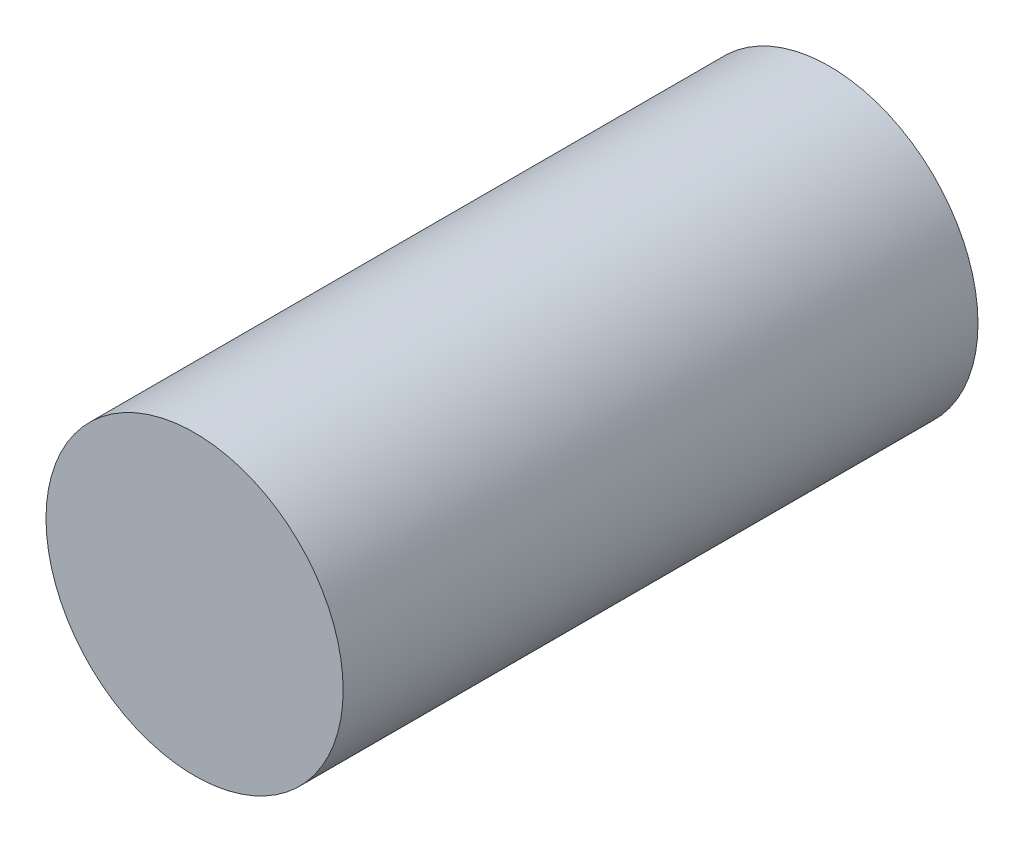
ISO-10303-21;
HEADER;
FILE_DESCRIPTION(('STEP AP214'),'2;1');
FILE_NAME('part.step','',(''),(''),'','','');
FILE_SCHEMA(('AUTOMOTIVE_DESIGN { 1 0 10303 214 1 1 1 1 }'));
ENDSEC;
DATA;
#1=APPLICATION_CONTEXT('core data for automotive mechanical design processes');
#2=APPLICATION_PROTOCOL_DEFINITION('international standard','automotive_design',2000,#1);
#3=PRODUCT_CONTEXT('',#1,'mechanical');
#4=PRODUCT('Part','Part','',(#3));
#5=PRODUCT_RELATED_PRODUCT_CATEGORY('part','',(#4));
#6=PRODUCT_DEFINITION_FORMATION('','',#4);
#7=PRODUCT_DEFINITION_CONTEXT('part definition',#1,'design');
#8=PRODUCT_DEFINITION('design','',#6,#7);
#9=PRODUCT_DEFINITION_SHAPE('','',#8);
#10=(LENGTH_UNIT() NAMED_UNIT(*) SI_UNIT(.MILLI.,.METRE.));
#11=(NAMED_UNIT(*) PLANE_ANGLE_UNIT() SI_UNIT($,.RADIAN.));
#12=(NAMED_UNIT(*) SI_UNIT($,.STERADIAN.) SOLID_ANGLE_UNIT());
#13=UNCERTAINTY_MEASURE_WITH_UNIT(LENGTH_MEASURE(1.E-05),#10,'distance_accuracy_value','');
#14=(GEOMETRIC_REPRESENTATION_CONTEXT(3) GLOBAL_UNCERTAINTY_ASSIGNED_CONTEXT((#13)) GLOBAL_UNIT_ASSIGNED_CONTEXT((#10,
#11,#12)) REPRESENTATION_CONTEXT('',''));
#15=CARTESIAN_POINT('',(0.,0.,0.));
#16=DIRECTION('',(0.,0.,1.));
#17=DIRECTION('',(1.,0.,0.));
#18=AXIS2_PLACEMENT_3D('',#15,#16,#17);
#19=CARTESIAN_POINT('',(0.,0.,47.));
#20=DIRECTION('',(0.,0.,-1.));
#21=DIRECTION('',(-1.,0.,0.));
#22=AXIS2_PLACEMENT_3D('',#19,#20,#21);
#23=CYLINDRICAL_SURFACE('',#22,11.);
#24=CARTESIAN_POINT('',(0.,0.,47.));
#25=DIRECTION('',(0.,0.,1.));
#26=DIRECTION('',(1.,0.,0.));
#27=AXIS2_PLACEMENT_3D('',#24,#25,#26);
#28=CIRCLE('',#27,11.);
#29=CARTESIAN_POINT('',(11.,0.,47.));
#30=VERTEX_POINT('',#29);
#31=EDGE_CURVE('E10',#30,#30,#28,.T.);
#32=ORIENTED_EDGE('',*,*,#31,.F.);
#33=EDGE_LOOP('',(#32));
#34=FACE_BOUND('',#33,.T.);
#35=CARTESIAN_POINT('',(0.,0.,0.));
#36=DIRECTION('',(0.,0.,1.));
#37=DIRECTION('',(1.,0.,0.));
#38=AXIS2_PLACEMENT_3D('',#35,#36,#37);
#39=CIRCLE('',#38,11.);
#40=CARTESIAN_POINT('',(11.,0.,0.));
#41=VERTEX_POINT('',#40);
#42=EDGE_CURVE('E33',#41,#41,#39,.T.);
#43=ORIENTED_EDGE('',*,*,#42,.T.);
#44=EDGE_LOOP('',(#43));
#45=FACE_BOUND('',#44,.T.);
#46=ADVANCED_FACE('F30',(#34,#45),#23,.T.);
#47=CARTESIAN_POINT('',(0.,0.,47.));
#48=DIRECTION('',(0.,0.,1.));
#49=DIRECTION('',(1.,0.,0.));
#50=AXIS2_PLACEMENT_3D('',#47,#48,#49);
#51=PLANE('',#50);
#52=ORIENTED_EDGE('',*,*,#31,.T.);
#53=EDGE_LOOP('',(#52));
#54=FACE_BOUND('',#53,.T.);
#55=ADVANCED_FACE('F45',(#54),#51,.T.);
#56=CARTESIAN_POINT('',(0.,0.,0.));
#57=DIRECTION('',(0.,0.,1.));
#58=DIRECTION('',(1.,0.,0.));
#59=AXIS2_PLACEMENT_3D('',#56,#57,#58);
#60=PLANE('',#59);
#61=ORIENTED_EDGE('',*,*,#42,.F.);
#62=EDGE_LOOP('',(#61));
#63=FACE_BOUND('',#62,.T.);
#64=ADVANCED_FACE('F43',(#63),#60,.F.);
#65=CLOSED_SHELL('',(#46,#55,#64));
#66=MANIFOLD_SOLID_BREP('B2',#65);
#67=ADVANCED_BREP_SHAPE_REPRESENTATION('',(#18,#66),#14);
#68=SHAPE_DEFINITION_REPRESENTATION(#9,#67);
ENDSEC;
END-ISO-10303-21;
